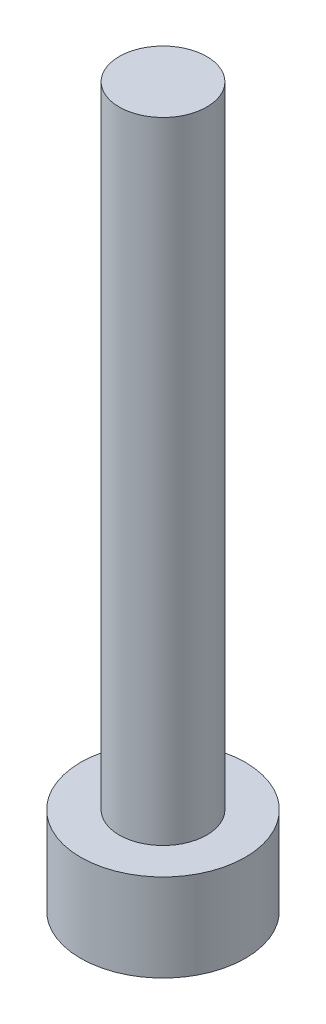
ISO-10303-21;
HEADER;
FILE_DESCRIPTION(('STEP AP214'),'2;1');
FILE_NAME('part.step','',(''),(''),'','','');
FILE_SCHEMA(('AUTOMOTIVE_DESIGN { 1 0 10303 214 1 1 1 1 }'));
ENDSEC;
DATA;
#1=APPLICATION_CONTEXT('core data for automotive mechanical design processes');
#2=APPLICATION_PROTOCOL_DEFINITION('international standard','automotive_design',2000,#1);
#3=PRODUCT_CONTEXT('',#1,'mechanical');
#4=PRODUCT('Part','Part','',(#3));
#5=PRODUCT_RELATED_PRODUCT_CATEGORY('part','',(#4));
#6=PRODUCT_DEFINITION_FORMATION('','',#4);
#7=PRODUCT_DEFINITION_CONTEXT('part definition',#1,'design');
#8=PRODUCT_DEFINITION('design','',#6,#7);
#9=PRODUCT_DEFINITION_SHAPE('','',#8);
#10=(LENGTH_UNIT() NAMED_UNIT(*) SI_UNIT(.MILLI.,.METRE.));
#11=(NAMED_UNIT(*) PLANE_ANGLE_UNIT() SI_UNIT($,.RADIAN.));
#12=(NAMED_UNIT(*) SI_UNIT($,.STERADIAN.) SOLID_ANGLE_UNIT());
#13=UNCERTAINTY_MEASURE_WITH_UNIT(LENGTH_MEASURE(1.E-05),#10,'distance_accuracy_value','');
#14=(GEOMETRIC_REPRESENTATION_CONTEXT(3) GLOBAL_UNCERTAINTY_ASSIGNED_CONTEXT((#13)) GLOBAL_UNIT_ASSIGNED_CONTEXT((#10,
#11,#12)) REPRESENTATION_CONTEXT('',''));
#15=CARTESIAN_POINT('',(0.,0.,0.));
#16=DIRECTION('',(0.,0.,1.));
#17=DIRECTION('',(1.,0.,0.));
#18=AXIS2_PLACEMENT_3D('',#15,#16,#17);
#19=CARTESIAN_POINT('',(0.,2.5,0.));
#20=DIRECTION('',(0.,-1.,0.));
#21=DIRECTION('',(0.,0.,-1.));
#22=AXIS2_PLACEMENT_3D('',#19,#20,#21);
#23=CYLINDRICAL_SURFACE('',#22,2.35);
#24=CARTESIAN_POINT('',(0.,2.5,0.));
#25=DIRECTION('',(0.,1.,0.));
#26=DIRECTION('',(0.,0.,1.));
#27=AXIS2_PLACEMENT_3D('',#24,#25,#26);
#28=CIRCLE('',#27,2.35);
#29=CARTESIAN_POINT('',(0.,2.5,2.35));
#30=VERTEX_POINT('',#29);
#31=EDGE_CURVE('E42',#30,#30,#28,.T.);
#32=ORIENTED_EDGE('',*,*,#31,.F.);
#33=EDGE_LOOP('',(#32));
#34=FACE_BOUND('',#33,.T.);
#35=CARTESIAN_POINT('',(0.,0.,0.));
#36=DIRECTION('',(0.,1.,0.));
#37=DIRECTION('',(0.,0.,1.));
#38=AXIS2_PLACEMENT_3D('',#35,#36,#37);
#39=CIRCLE('',#38,2.35);
#40=CARTESIAN_POINT('',(0.,0.,2.35));
#41=VERTEX_POINT('',#40);
#42=EDGE_CURVE('E38',#41,#41,#39,.T.);
#43=ORIENTED_EDGE('',*,*,#42,.T.);
#44=EDGE_LOOP('',(#43));
#45=FACE_BOUND('',#44,.T.);
#46=ADVANCED_FACE('F35',(#34,#45),#23,.T.);
#47=CARTESIAN_POINT('',(0.,2.5,0.));
#48=DIRECTION('',(0.,1.,0.));
#49=DIRECTION('',(0.,0.,1.));
#50=AXIS2_PLACEMENT_3D('',#47,#48,#49);
#51=PLANE('',#50);
#52=CARTESIAN_POINT('',(0.,2.5,0.));
#53=DIRECTION('',(0.,1.,0.));
#54=DIRECTION('',(0.,0.,1.));
#55=AXIS2_PLACEMENT_3D('',#52,#53,#54);
#56=CIRCLE('',#55,1.25);
#57=CARTESIAN_POINT('',(0.,2.5,1.25));
#58=VERTEX_POINT('',#57);
#59=EDGE_CURVE('E10',#58,#58,#56,.T.);
#60=ORIENTED_EDGE('',*,*,#59,.F.);
#61=EDGE_LOOP('',(#60));
#62=FACE_BOUND('',#61,.T.);
#63=ORIENTED_EDGE('',*,*,#31,.T.);
#64=EDGE_LOOP('',(#63));
#65=FACE_BOUND('',#64,.T.);
#66=ADVANCED_FACE('F59',(#62,#65),#51,.T.);
#67=CARTESIAN_POINT('',(0.,0.,0.));
#68=DIRECTION('',(0.,1.,0.));
#69=DIRECTION('',(0.,0.,1.));
#70=AXIS2_PLACEMENT_3D('',#67,#68,#69);
#71=PLANE('',#70);
#72=ORIENTED_EDGE('',*,*,#42,.F.);
#73=EDGE_LOOP('',(#72));
#74=FACE_BOUND('',#73,.T.);
#75=ADVANCED_FACE('F56',(#74),#71,.F.);
#76=CARTESIAN_POINT('',(0.,20.5,0.));
#77=DIRECTION('',(0.,-1.,0.));
#78=DIRECTION('',(0.,0.,-1.));
#79=AXIS2_PLACEMENT_3D('',#76,#77,#78);
#80=CYLINDRICAL_SURFACE('',#79,1.25);
#81=CARTESIAN_POINT('',(0.,20.5,0.));
#82=DIRECTION('',(0.,1.,0.));
#83=DIRECTION('',(0.,0.,1.));
#84=AXIS2_PLACEMENT_3D('',#81,#82,#83);
#85=CIRCLE('',#84,1.25);
#86=CARTESIAN_POINT('',(0.,20.5,1.25));
#87=VERTEX_POINT('',#86);
#88=EDGE_CURVE('E48',#87,#87,#85,.T.);
#89=ORIENTED_EDGE('',*,*,#88,.F.);
#90=EDGE_LOOP('',(#89));
#91=FACE_BOUND('',#90,.T.);
#92=ORIENTED_EDGE('',*,*,#59,.T.);
#93=EDGE_LOOP('',(#92));
#94=FACE_BOUND('',#93,.T.);
#95=ADVANCED_FACE('F58',(#91,#94),#80,.T.);
#96=CARTESIAN_POINT('',(0.,20.5,0.));
#97=DIRECTION('',(0.,1.,0.));
#98=DIRECTION('',(0.,0.,1.));
#99=AXIS2_PLACEMENT_3D('',#96,#97,#98);
#100=PLANE('',#99);
#101=ORIENTED_EDGE('',*,*,#88,.T.);
#102=EDGE_LOOP('',(#101));
#103=FACE_BOUND('',#102,.T.);
#104=ADVANCED_FACE('F65',(#103),#100,.T.);
#105=CLOSED_SHELL('',(#46,#66,#75,#95,#104));
#106=MANIFOLD_SOLID_BREP('B2',#105);
#107=ADVANCED_BREP_SHAPE_REPRESENTATION('',(#18,#106),#14);
#108=SHAPE_DEFINITION_REPRESENTATION(#9,#107);
ENDSEC;
END-ISO-10303-21;
